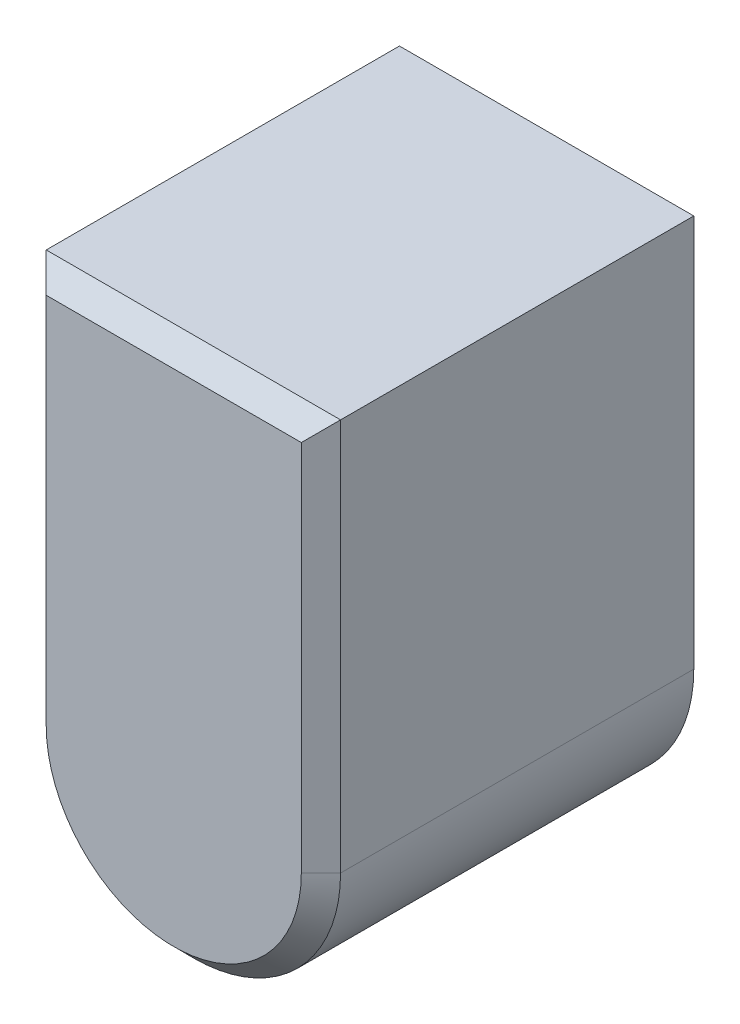
ISO-10303-21;
HEADER;
FILE_DESCRIPTION(('STEP AP214'),'2;1');
FILE_NAME('part.step','',(''),(''),'','','');
FILE_SCHEMA(('AUTOMOTIVE_DESIGN { 1 0 10303 214 1 1 1 1 }'));
ENDSEC;
DATA;
#1=APPLICATION_CONTEXT('core data for automotive mechanical design processes');
#2=APPLICATION_PROTOCOL_DEFINITION('international standard','automotive_design',2000,#1);
#3=PRODUCT_CONTEXT('',#1,'mechanical');
#4=PRODUCT('Part','Part','',(#3));
#5=PRODUCT_RELATED_PRODUCT_CATEGORY('part','',(#4));
#6=PRODUCT_DEFINITION_FORMATION('','',#4);
#7=PRODUCT_DEFINITION_CONTEXT('part definition',#1,'design');
#8=PRODUCT_DEFINITION('design','',#6,#7);
#9=PRODUCT_DEFINITION_SHAPE('','',#8);
#10=(LENGTH_UNIT() NAMED_UNIT(*) SI_UNIT(.MILLI.,.METRE.));
#11=(NAMED_UNIT(*) PLANE_ANGLE_UNIT() SI_UNIT($,.RADIAN.));
#12=(NAMED_UNIT(*) SI_UNIT($,.STERADIAN.) SOLID_ANGLE_UNIT());
#13=UNCERTAINTY_MEASURE_WITH_UNIT(LENGTH_MEASURE(1.E-05),#10,'distance_accuracy_value','');
#14=(GEOMETRIC_REPRESENTATION_CONTEXT(3) GLOBAL_UNCERTAINTY_ASSIGNED_CONTEXT((#13)) GLOBAL_UNIT_ASSIGNED_CONTEXT((#10,
#11,#12)) REPRESENTATION_CONTEXT('',''));
#15=CARTESIAN_POINT('',(0.,0.,0.));
#16=DIRECTION('',(0.,0.,1.));
#17=DIRECTION('',(1.,0.,0.));
#18=AXIS2_PLACEMENT_3D('',#15,#16,#17);
#19=CARTESIAN_POINT('',(0.,-2.,4.));
#20=DIRECTION('',(0.,0.,-1.));
#21=DIRECTION('',(-1.,0.,0.));
#22=AXIS2_PLACEMENT_3D('',#19,#20,#21);
#23=CYLINDRICAL_SURFACE('',#22,1.5);
#24=DIRECTION('',(0.,0.,-1.));
#25=VECTOR('',#24,1.);
#26=CARTESIAN_POINT('',(-1.5,-2.,4.));
#27=LINE('',#26,#25);
#28=CARTESIAN_POINT('',(-1.5,-2.,3.8));
#29=VERTEX_POINT('',#28);
#30=CARTESIAN_POINT('',(-1.5,-2.,0.2));
#31=VERTEX_POINT('',#30);
#32=EDGE_CURVE('E160',#29,#31,#27,.T.);
#33=ORIENTED_EDGE('',*,*,#32,.T.);
#34=CARTESIAN_POINT('',(0.,-2.,0.2));
#35=DIRECTION('',(0.,0.,1.));
#36=DIRECTION('',(1.,0.,0.));
#37=AXIS2_PLACEMENT_3D('',#34,#35,#36);
#38=CIRCLE('',#37,1.5);
#39=CARTESIAN_POINT('',(1.5,-2.,0.2));
#40=VERTEX_POINT('',#39);
#41=EDGE_CURVE('E129',#31,#40,#38,.T.);
#42=ORIENTED_EDGE('',*,*,#41,.T.);
#43=DIRECTION('',(0.,0.,-1.));
#44=VECTOR('',#43,1.);
#45=CARTESIAN_POINT('',(1.5,-2.,4.));
#46=LINE('',#45,#44);
#47=CARTESIAN_POINT('',(1.5,-2.,3.8));
#48=VERTEX_POINT('',#47);
#49=EDGE_CURVE('E113',#48,#40,#46,.T.);
#50=ORIENTED_EDGE('',*,*,#49,.F.);
#51=CARTESIAN_POINT('',(0.,-2.,3.8));
#52=DIRECTION('',(0.,0.,1.));
#53=DIRECTION('',(1.,0.,0.));
#54=AXIS2_PLACEMENT_3D('',#51,#52,#53);
#55=CIRCLE('',#54,1.5);
#56=EDGE_CURVE('E126',#48,#29,#55,.F.);
#57=ORIENTED_EDGE('',*,*,#56,.T.);
#58=EDGE_LOOP('',(#33,#42,#50,#57));
#59=FACE_BOUND('',#58,.T.);
#60=ADVANCED_FACE('F39',(#59),#23,.T.);
#61=CARTESIAN_POINT('',(1.5,-2.,4.));
#62=DIRECTION('',(-1.,0.,0.));
#63=DIRECTION('',(0.,-1.,0.));
#64=AXIS2_PLACEMENT_3D('',#61,#62,#63);
#65=PLANE('',#64);
#66=ORIENTED_EDGE('',*,*,#49,.T.);
#67=DIRECTION('',(0.,1.,0.));
#68=VECTOR('',#67,1.);
#69=CARTESIAN_POINT('',(1.5,-2.,0.2));
#70=LINE('',#69,#68);
#71=CARTESIAN_POINT('',(1.5,2.,0.2));
#72=VERTEX_POINT('',#71);
#73=EDGE_CURVE('E119',#40,#72,#70,.T.);
#74=ORIENTED_EDGE('',*,*,#73,.T.);
#75=DIRECTION('',(0.,0.,-1.));
#76=VECTOR('',#75,1.);
#77=CARTESIAN_POINT('',(1.5,2.,4.));
#78=LINE('',#77,#76);
#79=CARTESIAN_POINT('',(1.5,2.,3.8));
#80=VERTEX_POINT('',#79);
#81=EDGE_CURVE('E115',#80,#72,#78,.T.);
#82=ORIENTED_EDGE('',*,*,#81,.F.);
#83=DIRECTION('',(0.,-1.,0.));
#84=VECTOR('',#83,1.);
#85=CARTESIAN_POINT('',(1.5,-2.,3.8));
#86=LINE('',#85,#84);
#87=EDGE_CURVE('E110',#80,#48,#86,.T.);
#88=ORIENTED_EDGE('',*,*,#87,.T.);
#89=EDGE_LOOP('',(#66,#74,#82,#88));
#90=FACE_BOUND('',#89,.T.);
#91=ADVANCED_FACE('F112',(#90),#65,.F.);
#92=CARTESIAN_POINT('',(-1.5,-2.,4.));
#93=DIRECTION('',(1.,0.,0.));
#94=DIRECTION('',(0.,1.,0.));
#95=AXIS2_PLACEMENT_3D('',#92,#93,#94);
#96=PLANE('',#95);
#97=DIRECTION('',(0.,0.,-1.));
#98=VECTOR('',#97,1.);
#99=CARTESIAN_POINT('',(-1.5,2.,4.));
#100=LINE('',#99,#98);
#101=CARTESIAN_POINT('',(-1.5,2.,3.8));
#102=VERTEX_POINT('',#101);
#103=CARTESIAN_POINT('',(-1.5,2.,0.2));
#104=VERTEX_POINT('',#103);
#105=EDGE_CURVE('E165',#102,#104,#100,.T.);
#106=ORIENTED_EDGE('',*,*,#105,.T.);
#107=DIRECTION('',(0.,-1.,0.));
#108=VECTOR('',#107,1.);
#109=CARTESIAN_POINT('',(-1.5,-2.,0.2));
#110=LINE('',#109,#108);
#111=EDGE_CURVE('E188',#104,#31,#110,.T.);
#112=ORIENTED_EDGE('',*,*,#111,.T.);
#113=ORIENTED_EDGE('',*,*,#32,.F.);
#114=DIRECTION('',(0.,1.,0.));
#115=VECTOR('',#114,1.);
#116=CARTESIAN_POINT('',(-1.5,2.,3.8));
#117=LINE('',#116,#115);
#118=EDGE_CURVE('E186',#29,#102,#117,.T.);
#119=ORIENTED_EDGE('',*,*,#118,.T.);
#120=EDGE_LOOP('',(#106,#112,#113,#119));
#121=FACE_BOUND('',#120,.T.);
#122=ADVANCED_FACE('F199',(#121),#96,.F.);
#123=CARTESIAN_POINT('',(0.,-2.,4.));
#124=DIRECTION('',(0.,0.,1.));
#125=DIRECTION('',(1.,0.,0.));
#126=AXIS2_PLACEMENT_3D('',#123,#124,#125);
#127=PLANE('',#126);
#128=DIRECTION('',(0.,-1.,0.));
#129=VECTOR('',#128,1.);
#130=CARTESIAN_POINT('',(-1.3,-2.,4.));
#131=LINE('',#130,#129);
#132=CARTESIAN_POINT('',(-1.3,1.8,4.));
#133=VERTEX_POINT('',#132);
#134=CARTESIAN_POINT('',(-1.3,-2.,4.));
#135=VERTEX_POINT('',#134);
#136=EDGE_CURVE('E64',#133,#135,#131,.T.);
#137=ORIENTED_EDGE('',*,*,#136,.T.);
#138=CARTESIAN_POINT('',(0.,-2.,4.));
#139=DIRECTION('',(0.,0.,1.));
#140=DIRECTION('',(1.,0.,0.));
#141=AXIS2_PLACEMENT_3D('',#138,#139,#140);
#142=CIRCLE('',#141,1.3);
#143=CARTESIAN_POINT('',(1.3,-2.,4.));
#144=VERTEX_POINT('',#143);
#145=EDGE_CURVE('E11',#135,#144,#142,.T.);
#146=ORIENTED_EDGE('',*,*,#145,.T.);
#147=DIRECTION('',(0.,1.,0.));
#148=VECTOR('',#147,1.);
#149=CARTESIAN_POINT('',(1.3,2.,4.));
#150=LINE('',#149,#148);
#151=CARTESIAN_POINT('',(1.3,1.8,4.));
#152=VERTEX_POINT('',#151);
#153=EDGE_CURVE('E49',#144,#152,#150,.T.);
#154=ORIENTED_EDGE('',*,*,#153,.T.);
#155=DIRECTION('',(-1.,0.,0.));
#156=VECTOR('',#155,1.);
#157=CARTESIAN_POINT('',(-1.5,1.8,4.));
#158=LINE('',#157,#156);
#159=EDGE_CURVE('E190',#152,#133,#158,.T.);
#160=ORIENTED_EDGE('',*,*,#159,.T.);
#161=EDGE_LOOP('',(#137,#146,#154,#160));
#162=FACE_BOUND('',#161,.T.);
#163=ADVANCED_FACE('F193',(#162),#127,.T.);
#164=CARTESIAN_POINT('',(0.,-2.,0.));
#165=DIRECTION('',(0.,0.,1.));
#166=DIRECTION('',(1.,0.,0.));
#167=AXIS2_PLACEMENT_3D('',#164,#165,#166);
#168=PLANE('',#167);
#169=DIRECTION('',(0.,-1.,0.));
#170=VECTOR('',#169,1.);
#171=CARTESIAN_POINT('',(1.3,-2.,0.));
#172=LINE('',#171,#170);
#173=CARTESIAN_POINT('',(1.3,1.8,0.));
#174=VERTEX_POINT('',#173);
#175=CARTESIAN_POINT('',(1.3,-2.,0.));
#176=VERTEX_POINT('',#175);
#177=EDGE_CURVE('E177',#174,#176,#172,.T.);
#178=ORIENTED_EDGE('',*,*,#177,.T.);
#179=CARTESIAN_POINT('',(0.,-2.,0.));
#180=DIRECTION('',(0.,0.,1.));
#181=DIRECTION('',(1.,0.,0.));
#182=AXIS2_PLACEMENT_3D('',#179,#180,#181);
#183=CIRCLE('',#182,1.3);
#184=CARTESIAN_POINT('',(-1.3,-2.,0.));
#185=VERTEX_POINT('',#184);
#186=EDGE_CURVE('E120',#176,#185,#183,.F.);
#187=ORIENTED_EDGE('',*,*,#186,.T.);
#188=DIRECTION('',(0.,1.,0.));
#189=VECTOR('',#188,1.);
#190=CARTESIAN_POINT('',(-1.3,-2.,0.));
#191=LINE('',#190,#189);
#192=CARTESIAN_POINT('',(-1.3,1.8,0.));
#193=VERTEX_POINT('',#192);
#194=EDGE_CURVE('E173',#185,#193,#191,.T.);
#195=ORIENTED_EDGE('',*,*,#194,.T.);
#196=DIRECTION('',(1.,0.,0.));
#197=VECTOR('',#196,1.);
#198=CARTESIAN_POINT('',(0.,1.8,0.));
#199=LINE('',#198,#197);
#200=EDGE_CURVE('E175',#193,#174,#199,.T.);
#201=ORIENTED_EDGE('',*,*,#200,.T.);
#202=EDGE_LOOP('',(#178,#187,#195,#201));
#203=FACE_BOUND('',#202,.T.);
#204=ADVANCED_FACE('F226',(#203),#168,.F.);
#205=CARTESIAN_POINT('',(-1.5,2.,-0.00100000000000013));
#206=DIRECTION('',(0.,-1.,0.));
#207=DIRECTION('',(1.,0.,0.));
#208=AXIS2_PLACEMENT_3D('',#205,#206,#207);
#209=PLANE('',#208);
#210=ORIENTED_EDGE('',*,*,#81,.T.);
#211=DIRECTION('',(-1.,0.,0.));
#212=VECTOR('',#211,1.);
#213=CARTESIAN_POINT('',(-1.5,2.,0.2));
#214=LINE('',#213,#212);
#215=EDGE_CURVE('E184',#72,#104,#214,.T.);
#216=ORIENTED_EDGE('',*,*,#215,.T.);
#217=ORIENTED_EDGE('',*,*,#105,.F.);
#218=DIRECTION('',(1.,0.,0.));
#219=VECTOR('',#218,1.);
#220=CARTESIAN_POINT('',(1.5,2.,3.8));
#221=LINE('',#220,#219);
#222=EDGE_CURVE('E182',#102,#80,#221,.T.);
#223=ORIENTED_EDGE('',*,*,#222,.T.);
#224=EDGE_LOOP('',(#210,#216,#217,#223));
#225=FACE_BOUND('',#224,.T.);
#226=ADVANCED_FACE('F201',(#225),#209,.F.);
#227=CARTESIAN_POINT('',(-1.5,2.,0.2));
#228=DIRECTION('',(0.,-0.707106781186546,0.707106781186549));
#229=DIRECTION('',(-1.,0.,0.));
#230=AXIS2_PLACEMENT_3D('',#227,#228,#229);
#231=PLANE('',#230);
#232=DIRECTION('',(-0.577350269189627,-0.577350269189627,-0.577350269189624));
#233=VECTOR('',#232,1.);
#234=CARTESIAN_POINT('',(0.499999999999996,0.999999999999997,-0.799999999999999));
#235=LINE('',#234,#233);
#236=EDGE_CURVE('E152',#174,#72,#235,.F.);
#237=ORIENTED_EDGE('',*,*,#236,.F.);
#238=ORIENTED_EDGE('',*,*,#200,.F.);
#239=DIRECTION('',(0.577350269189627,-0.577350269189626,-0.577350269189624));
#240=VECTOR('',#239,1.);
#241=CARTESIAN_POINT('',(-0.166666666666664,0.666666666666663,-1.13333333333333));
#242=LINE('',#241,#240);
#243=EDGE_CURVE('E140',#104,#193,#242,.T.);
#244=ORIENTED_EDGE('',*,*,#243,.F.);
#245=ORIENTED_EDGE('',*,*,#215,.F.);
#246=EDGE_LOOP('',(#237,#238,#244,#245));
#247=FACE_BOUND('',#246,.T.);
#248=ADVANCED_FACE('F204',(#247),#231,.F.);
#249=CARTESIAN_POINT('',(-1.5,-2.,0.2));
#250=DIRECTION('',(0.707106781186546,0.,0.707106781186549));
#251=DIRECTION('',(0.,-1.,0.));
#252=AXIS2_PLACEMENT_3D('',#249,#250,#251);
#253=PLANE('',#252);
#254=ORIENTED_EDGE('',*,*,#243,.T.);
#255=ORIENTED_EDGE('',*,*,#194,.F.);
#256=DIRECTION('',(0.707106781186549,0.,-0.707106781186546));
#257=VECTOR('',#256,1.);
#258=CARTESIAN_POINT('',(-1.5,-2.,0.2));
#259=LINE('',#258,#257);
#260=EDGE_CURVE('E146',#31,#185,#259,.T.);
#261=ORIENTED_EDGE('',*,*,#260,.F.);
#262=ORIENTED_EDGE('',*,*,#111,.F.);
#263=EDGE_LOOP('',(#254,#255,#261,#262));
#264=FACE_BOUND('',#263,.T.);
#265=ADVANCED_FACE('F206',(#264),#253,.F.);
#266=CARTESIAN_POINT('',(1.5,-2.,0.2));
#267=DIRECTION('',(-0.707106781186546,0.,0.707106781186549));
#268=DIRECTION('',(0.,1.,0.));
#269=AXIS2_PLACEMENT_3D('',#266,#267,#268);
#270=PLANE('',#269);
#271=ORIENTED_EDGE('',*,*,#236,.T.);
#272=ORIENTED_EDGE('',*,*,#73,.F.);
#273=DIRECTION('',(0.707106781186549,0.,0.707106781186546));
#274=VECTOR('',#273,1.);
#275=CARTESIAN_POINT('',(1.3,-2.,0.));
#276=LINE('',#275,#274);
#277=EDGE_CURVE('E143',#176,#40,#276,.T.);
#278=ORIENTED_EDGE('',*,*,#277,.F.);
#279=ORIENTED_EDGE('',*,*,#177,.F.);
#280=EDGE_LOOP('',(#271,#272,#278,#279));
#281=FACE_BOUND('',#280,.T.);
#282=ADVANCED_FACE('F209',(#281),#270,.F.);
#283=CARTESIAN_POINT('',(0.,-2.,0.2));
#284=DIRECTION('',(0.,0.,1.));
#285=DIRECTION('',(1.,0.,0.));
#286=AXIS2_PLACEMENT_3D('',#283,#284,#285);
#287=CONICAL_SURFACE('',#286,1.5,0.78539816339745);
#288=ORIENTED_EDGE('',*,*,#260,.T.);
#289=ORIENTED_EDGE('',*,*,#186,.F.);
#290=ORIENTED_EDGE('',*,*,#277,.T.);
#291=ORIENTED_EDGE('',*,*,#41,.F.);
#292=EDGE_LOOP('',(#288,#289,#290,#291));
#293=FACE_BOUND('',#292,.T.);
#294=ADVANCED_FACE('F207',(#293),#287,.T.);
#295=CARTESIAN_POINT('',(-1.5,2.,3.8));
#296=DIRECTION('',(0.,0.707106781186546,0.707106781186549));
#297=DIRECTION('',(-1.,0.,0.));
#298=AXIS2_PLACEMENT_3D('',#295,#296,#297);
#299=PLANE('',#298);
#300=DIRECTION('',(0.577350269189627,0.577350269189627,-0.577350269189624));
#301=VECTOR('',#300,1.);
#302=CARTESIAN_POINT('',(0.499999999999997,0.999999999999997,4.8));
#303=LINE('',#302,#301);
#304=EDGE_CURVE('E137',#80,#152,#303,.F.);
#305=ORIENTED_EDGE('',*,*,#304,.F.);
#306=ORIENTED_EDGE('',*,*,#222,.F.);
#307=DIRECTION('',(0.577350269189627,-0.577350269189627,0.577350269189624));
#308=VECTOR('',#307,1.);
#309=CARTESIAN_POINT('',(-1.5,2.,3.8));
#310=LINE('',#309,#308);
#311=EDGE_CURVE('E44',#133,#102,#310,.F.);
#312=ORIENTED_EDGE('',*,*,#311,.F.);
#313=ORIENTED_EDGE('',*,*,#159,.F.);
#314=EDGE_LOOP('',(#305,#306,#312,#313));
#315=FACE_BOUND('',#314,.T.);
#316=ADVANCED_FACE('F42',(#315),#299,.T.);
#317=CARTESIAN_POINT('',(-1.3,-2.,4.));
#318=DIRECTION('',(-0.707106781186546,0.,0.707106781186549));
#319=DIRECTION('',(0.,1.,0.));
#320=AXIS2_PLACEMENT_3D('',#317,#318,#319);
#321=PLANE('',#320);
#322=ORIENTED_EDGE('',*,*,#311,.T.);
#323=ORIENTED_EDGE('',*,*,#118,.F.);
#324=DIRECTION('',(-0.707106781186549,0.,-0.707106781186546));
#325=VECTOR('',#324,1.);
#326=CARTESIAN_POINT('',(-1.3,-2.,4.));
#327=LINE('',#326,#325);
#328=EDGE_CURVE('E132',#135,#29,#327,.T.);
#329=ORIENTED_EDGE('',*,*,#328,.F.);
#330=ORIENTED_EDGE('',*,*,#136,.F.);
#331=EDGE_LOOP('',(#322,#323,#329,#330));
#332=FACE_BOUND('',#331,.T.);
#333=ADVANCED_FACE('F196',(#332),#321,.T.);
#334=CARTESIAN_POINT('',(1.3,-2.,4.));
#335=DIRECTION('',(0.707106781186546,0.,0.707106781186549));
#336=DIRECTION('',(0.,-1.,0.));
#337=AXIS2_PLACEMENT_3D('',#334,#335,#336);
#338=PLANE('',#337);
#339=ORIENTED_EDGE('',*,*,#304,.T.);
#340=ORIENTED_EDGE('',*,*,#153,.F.);
#341=DIRECTION('',(-0.707106781186549,0.,0.707106781186546));
#342=VECTOR('',#341,1.);
#343=CARTESIAN_POINT('',(1.5,-2.,3.8));
#344=LINE('',#343,#342);
#345=EDGE_CURVE('E57',#48,#144,#344,.T.);
#346=ORIENTED_EDGE('',*,*,#345,.F.);
#347=ORIENTED_EDGE('',*,*,#87,.F.);
#348=EDGE_LOOP('',(#339,#340,#346,#347));
#349=FACE_BOUND('',#348,.T.);
#350=ADVANCED_FACE('F135',(#349),#338,.T.);
#351=CARTESIAN_POINT('',(0.,-2.,4.));
#352=DIRECTION('',(0.,0.,-1.));
#353=DIRECTION('',(-1.,0.,0.));
#354=AXIS2_PLACEMENT_3D('',#351,#352,#353);
#355=CONICAL_SURFACE('',#354,1.3,0.78539816339745);
#356=ORIENTED_EDGE('',*,*,#328,.T.);
#357=ORIENTED_EDGE('',*,*,#56,.F.);
#358=ORIENTED_EDGE('',*,*,#345,.T.);
#359=ORIENTED_EDGE('',*,*,#145,.F.);
#360=EDGE_LOOP('',(#356,#357,#358,#359));
#361=FACE_BOUND('',#360,.T.);
#362=ADVANCED_FACE('F131',(#361),#355,.T.);
#363=CLOSED_SHELL('',(#60,#91,#122,#163,#204,#226,#248,#265,#282,#294,#316,#333,#350,#362));
#364=MANIFOLD_SOLID_BREP('B2',#363);
#365=ADVANCED_BREP_SHAPE_REPRESENTATION('',(#18,#364),#14);
#366=SHAPE_DEFINITION_REPRESENTATION(#9,#365);
ENDSEC;
END-ISO-10303-21;
